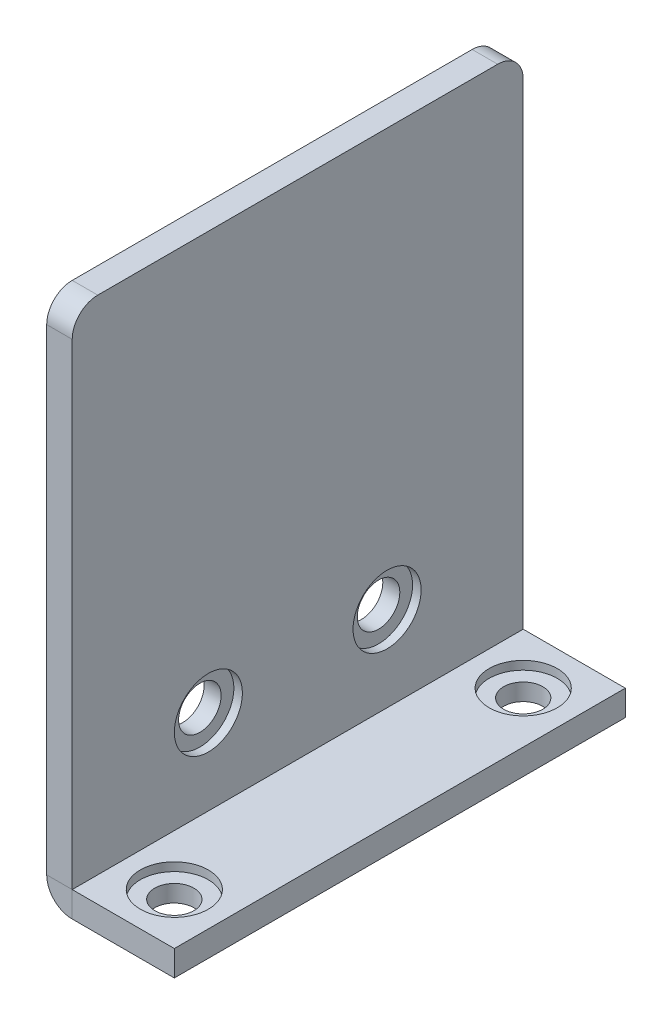
ISO-10303-21;
HEADER;
FILE_DESCRIPTION(('STEP AP214'),'2;1');
FILE_NAME('part.step','',(''),(''),'','','');
FILE_SCHEMA(('AUTOMOTIVE_DESIGN { 1 0 10303 214 1 1 1 1 }'));
ENDSEC;
DATA;
#1=APPLICATION_CONTEXT('core data for automotive mechanical design processes');
#2=APPLICATION_PROTOCOL_DEFINITION('international standard','automotive_design',2000,#1);
#3=PRODUCT_CONTEXT('',#1,'mechanical');
#4=PRODUCT('Part','Part','',(#3));
#5=PRODUCT_RELATED_PRODUCT_CATEGORY('part','',(#4));
#6=PRODUCT_DEFINITION_FORMATION('','',#4);
#7=PRODUCT_DEFINITION_CONTEXT('part definition',#1,'design');
#8=PRODUCT_DEFINITION('design','',#6,#7);
#9=PRODUCT_DEFINITION_SHAPE('','',#8);
#10=(LENGTH_UNIT() NAMED_UNIT(*) SI_UNIT(.MILLI.,.METRE.));
#11=(NAMED_UNIT(*) PLANE_ANGLE_UNIT() SI_UNIT($,.RADIAN.));
#12=(NAMED_UNIT(*) SI_UNIT($,.STERADIAN.) SOLID_ANGLE_UNIT());
#13=UNCERTAINTY_MEASURE_WITH_UNIT(LENGTH_MEASURE(1.E-05),#10,'distance_accuracy_value','');
#14=(GEOMETRIC_REPRESENTATION_CONTEXT(3) GLOBAL_UNCERTAINTY_ASSIGNED_CONTEXT((#13)) GLOBAL_UNIT_ASSIGNED_CONTEXT((#10,
#11,#12)) REPRESENTATION_CONTEXT('',''));
#15=CARTESIAN_POINT('',(0.,0.,0.));
#16=DIRECTION('',(0.,0.,1.));
#17=DIRECTION('',(1.,0.,0.));
#18=AXIS2_PLACEMENT_3D('',#15,#16,#17);
#19=CARTESIAN_POINT('',(0.,0.,53.));
#20=DIRECTION('',(0.,-1.,0.));
#21=DIRECTION('',(0.,0.,-1.));
#22=AXIS2_PLACEMENT_3D('',#19,#20,#21);
#23=PLANE('',#22);
#24=CARTESIAN_POINT('',(9.,0.,6.));
#25=DIRECTION('',(0.,1.,0.));
#26=DIRECTION('',(0.,0.,1.));
#27=AXIS2_PLACEMENT_3D('',#24,#25,#26);
#28=CIRCLE('',#27,2.30000000000001);
#29=CARTESIAN_POINT('',(9.,0.,8.30000000000001));
#30=VERTEX_POINT('',#29);
#31=EDGE_CURVE('E403',#30,#30,#28,.T.);
#32=ORIENTED_EDGE('',*,*,#31,.T.);
#33=EDGE_LOOP('',(#32));
#34=FACE_BOUND('',#33,.T.);
#35=DIRECTION('',(-1.,0.,0.));
#36=VECTOR('',#35,1.);
#37=CARTESIAN_POINT('',(0.,0.,0.));
#38=LINE('',#37,#36);
#39=CARTESIAN_POINT('',(15.,0.,0.));
#40=VERTEX_POINT('',#39);
#41=CARTESIAN_POINT('',(3.,0.,0.));
#42=VERTEX_POINT('',#41);
#43=EDGE_CURVE('E163',#40,#42,#38,.T.);
#44=ORIENTED_EDGE('',*,*,#43,.F.);
#45=DIRECTION('',(0.,0.,-1.));
#46=VECTOR('',#45,1.);
#47=CARTESIAN_POINT('',(15.,0.,53.));
#48=LINE('',#47,#46);
#49=CARTESIAN_POINT('',(15.,0.,53.));
#50=VERTEX_POINT('',#49);
#51=EDGE_CURVE('E176',#50,#40,#48,.T.);
#52=ORIENTED_EDGE('',*,*,#51,.F.);
#53=DIRECTION('',(-1.,0.,0.));
#54=VECTOR('',#53,1.);
#55=CARTESIAN_POINT('',(0.,0.,53.));
#56=LINE('',#55,#54);
#57=CARTESIAN_POINT('',(3.,0.,53.));
#58=VERTEX_POINT('',#57);
#59=EDGE_CURVE('E145',#50,#58,#56,.T.);
#60=ORIENTED_EDGE('',*,*,#59,.T.);
#61=DIRECTION('',(0.,0.,-1.));
#62=VECTOR('',#61,1.);
#63=CARTESIAN_POINT('',(3.,0.,53.));
#64=LINE('',#63,#62);
#65=EDGE_CURVE('E137',#58,#42,#64,.T.);
#66=ORIENTED_EDGE('',*,*,#65,.T.);
#67=EDGE_LOOP('',(#44,#52,#60,#66));
#68=FACE_BOUND('',#67,.T.);
#69=CARTESIAN_POINT('',(9.00000000000001,0.,47.));
#70=DIRECTION('',(0.,1.,0.));
#71=DIRECTION('',(0.,0.,1.));
#72=AXIS2_PLACEMENT_3D('',#69,#70,#71);
#73=CIRCLE('',#72,2.30000000000001);
#74=CARTESIAN_POINT('',(9.00000000000001,0.,49.3));
#75=VERTEX_POINT('',#74);
#76=EDGE_CURVE('E414',#75,#75,#73,.T.);
#77=ORIENTED_EDGE('',*,*,#76,.T.);
#78=EDGE_LOOP('',(#77));
#79=FACE_BOUND('',#78,.T.);
#80=ADVANCED_FACE('F41',(#34,#68,#79),#23,.T.);
#81=CARTESIAN_POINT('',(0.,3.,53.));
#82=DIRECTION('',(0.,-1.,0.));
#83=DIRECTION('',(0.,0.,-1.));
#84=AXIS2_PLACEMENT_3D('',#81,#82,#83);
#85=PLANE('',#84);
#86=CARTESIAN_POINT('',(9.,3.,6.));
#87=DIRECTION('',(0.,1.,0.));
#88=DIRECTION('',(0.,0.,1.));
#89=AXIS2_PLACEMENT_3D('',#86,#87,#88);
#90=CIRCLE('',#89,3.99999999999999);
#91=CARTESIAN_POINT('',(9.,3.,9.99999999999999));
#92=VERTEX_POINT('',#91);
#93=EDGE_CURVE('E394',#92,#92,#90,.T.);
#94=ORIENTED_EDGE('',*,*,#93,.F.);
#95=EDGE_LOOP('',(#94));
#96=FACE_BOUND('',#95,.T.);
#97=DIRECTION('',(1.,0.,0.));
#98=VECTOR('',#97,1.);
#99=CARTESIAN_POINT('',(0.,3.,0.));
#100=LINE('',#99,#98);
#101=CARTESIAN_POINT('',(15.,3.,0.));
#102=VERTEX_POINT('',#101);
#103=CARTESIAN_POINT('',(3.,3.,0.));
#104=VERTEX_POINT('',#103);
#105=EDGE_CURVE('E169',#102,#104,#100,.F.);
#106=ORIENTED_EDGE('',*,*,#105,.T.);
#107=DIRECTION('',(0.,0.,-1.));
#108=VECTOR('',#107,1.);
#109=CARTESIAN_POINT('',(3.,3.,53.));
#110=LINE('',#109,#108);
#111=CARTESIAN_POINT('',(3.,3.,53.));
#112=VERTEX_POINT('',#111);
#113=EDGE_CURVE('E155',#112,#104,#110,.T.);
#114=ORIENTED_EDGE('',*,*,#113,.F.);
#115=DIRECTION('',(1.,0.,0.));
#116=VECTOR('',#115,1.);
#117=CARTESIAN_POINT('',(0.,3.,53.));
#118=LINE('',#117,#116);
#119=CARTESIAN_POINT('',(15.,3.,53.));
#120=VERTEX_POINT('',#119);
#121=EDGE_CURVE('E153',#120,#112,#118,.F.);
#122=ORIENTED_EDGE('',*,*,#121,.F.);
#123=DIRECTION('',(0.,0.,-1.));
#124=VECTOR('',#123,1.);
#125=CARTESIAN_POINT('',(15.,3.,53.));
#126=LINE('',#125,#124);
#127=EDGE_CURVE('E174',#120,#102,#126,.T.);
#128=ORIENTED_EDGE('',*,*,#127,.T.);
#129=EDGE_LOOP('',(#106,#114,#122,#128));
#130=FACE_BOUND('',#129,.T.);
#131=CARTESIAN_POINT('',(9.00000000000001,3.,47.));
#132=DIRECTION('',(0.,1.,0.));
#133=DIRECTION('',(0.,0.,1.));
#134=AXIS2_PLACEMENT_3D('',#131,#132,#133);
#135=CIRCLE('',#134,3.99999999999999);
#136=CARTESIAN_POINT('',(9.00000000000001,3.,51.));
#137=VERTEX_POINT('',#136);
#138=EDGE_CURVE('E405',#137,#137,#135,.T.);
#139=ORIENTED_EDGE('',*,*,#138,.F.);
#140=EDGE_LOOP('',(#139));
#141=FACE_BOUND('',#140,.T.);
#142=ADVANCED_FACE('F224',(#96,#130,#141),#85,.F.);
#143=CARTESIAN_POINT('',(3.,3.,53.));
#144=DIRECTION('',(0.,0.,1.));
#145=DIRECTION('',(1.,0.,0.));
#146=AXIS2_PLACEMENT_3D('',#143,#144,#145);
#147=PLANE('',#146);
#148=DIRECTION('',(0.,1.,0.));
#149=VECTOR('',#148,1.);
#150=CARTESIAN_POINT('',(3.,0.,53.));
#151=LINE('',#150,#149);
#152=CARTESIAN_POINT('',(3.,59.,53.));
#153=VERTEX_POINT('',#152);
#154=EDGE_CURVE('E140',#112,#153,#151,.T.);
#155=ORIENTED_EDGE('',*,*,#154,.T.);
#156=DIRECTION('',(1.,0.,0.));
#157=VECTOR('',#156,1.);
#158=CARTESIAN_POINT('',(3.,59.,53.));
#159=LINE('',#158,#157);
#160=CARTESIAN_POINT('',(0.,59.,53.));
#161=VERTEX_POINT('',#160);
#162=EDGE_CURVE('E65',#153,#161,#159,.F.);
#163=ORIENTED_EDGE('',*,*,#162,.T.);
#164=DIRECTION('',(0.,1.,0.));
#165=VECTOR('',#164,1.);
#166=CARTESIAN_POINT('',(0.,0.,53.));
#167=LINE('',#166,#165);
#168=CARTESIAN_POINT('',(0.,3.,53.));
#169=VERTEX_POINT('',#168);
#170=EDGE_CURVE('E130',#169,#161,#167,.T.);
#171=ORIENTED_EDGE('',*,*,#170,.F.);
#172=DIRECTION('',(-1.,0.,0.));
#173=VECTOR('',#172,1.);
#174=CARTESIAN_POINT('',(3.,3.,53.));
#175=LINE('',#174,#173);
#176=EDGE_CURVE('E117',#112,#169,#175,.T.);
#177=ORIENTED_EDGE('',*,*,#176,.F.);
#178=EDGE_LOOP('',(#155,#163,#171,#177));
#179=FACE_BOUND('',#178,.T.);
#180=ADVANCED_FACE('F139',(#179),#147,.T.);
#181=CARTESIAN_POINT('',(3.,3.,53.));
#182=DIRECTION('',(0.,0.,1.));
#183=DIRECTION('',(1.,0.,0.));
#184=AXIS2_PLACEMENT_3D('',#181,#182,#183);
#185=PLANE('',#184);
#186=DIRECTION('',(0.,-1.,0.));
#187=VECTOR('',#186,1.);
#188=CARTESIAN_POINT('',(3.,3.,53.));
#189=LINE('',#188,#187);
#190=EDGE_CURVE('E123',#112,#58,#189,.T.);
#191=ORIENTED_EDGE('',*,*,#190,.F.);
#192=ORIENTED_EDGE('',*,*,#176,.T.);
#193=CARTESIAN_POINT('',(3.,3.,53.));
#194=DIRECTION('',(0.,0.,1.));
#195=DIRECTION('',(1.,0.,0.));
#196=AXIS2_PLACEMENT_3D('',#193,#194,#195);
#197=CIRCLE('',#196,3.);
#198=EDGE_CURVE('E121',#58,#169,#197,.F.);
#199=ORIENTED_EDGE('',*,*,#198,.F.);
#200=EDGE_LOOP('',(#191,#192,#199));
#201=FACE_BOUND('',#200,.T.);
#202=ADVANCED_FACE('F119',(#201),#185,.T.);
#203=CARTESIAN_POINT('',(3.,3.,0.));
#204=DIRECTION('',(0.,0.,-1.));
#205=DIRECTION('',(-1.,0.,0.));
#206=AXIS2_PLACEMENT_3D('',#203,#204,#205);
#207=PLANE('',#206);
#208=DIRECTION('',(0.,-1.,0.));
#209=VECTOR('',#208,1.);
#210=CARTESIAN_POINT('',(3.,3.,0.));
#211=LINE('',#210,#209);
#212=EDGE_CURVE('E185',#104,#42,#211,.T.);
#213=ORIENTED_EDGE('',*,*,#212,.F.);
#214=ORIENTED_EDGE('',*,*,#105,.F.);
#215=DIRECTION('',(0.,-1.,0.));
#216=VECTOR('',#215,1.);
#217=CARTESIAN_POINT('',(15.,3.,0.));
#218=LINE('',#217,#216);
#219=EDGE_CURVE('E166',#102,#40,#218,.T.);
#220=ORIENTED_EDGE('',*,*,#219,.T.);
#221=ORIENTED_EDGE('',*,*,#43,.T.);
#222=EDGE_LOOP('',(#213,#214,#220,#221));
#223=FACE_BOUND('',#222,.T.);
#224=ADVANCED_FACE('F254',(#223),#207,.T.);
#225=CARTESIAN_POINT('',(3.,3.,0.));
#226=DIRECTION('',(0.,0.,-1.));
#227=DIRECTION('',(-1.,0.,0.));
#228=AXIS2_PLACEMENT_3D('',#225,#226,#227);
#229=PLANE('',#228);
#230=DIRECTION('',(-1.,0.,0.));
#231=VECTOR('',#230,1.);
#232=CARTESIAN_POINT('',(3.,3.,0.));
#233=LINE('',#232,#231);
#234=CARTESIAN_POINT('',(0.,3.,0.));
#235=VERTEX_POINT('',#234);
#236=EDGE_CURVE('E183',#104,#235,#233,.T.);
#237=ORIENTED_EDGE('',*,*,#236,.F.);
#238=ORIENTED_EDGE('',*,*,#212,.T.);
#239=CARTESIAN_POINT('',(3.,3.,0.));
#240=DIRECTION('',(0.,0.,1.));
#241=DIRECTION('',(1.,0.,0.));
#242=AXIS2_PLACEMENT_3D('',#239,#240,#241);
#243=CIRCLE('',#242,3.);
#244=EDGE_CURVE('E161',#42,#235,#243,.F.);
#245=ORIENTED_EDGE('',*,*,#244,.T.);
#246=EDGE_LOOP('',(#237,#238,#245));
#247=FACE_BOUND('',#246,.T.);
#248=ADVANCED_FACE('F250',(#247),#229,.T.);
#249=CARTESIAN_POINT('',(3.,0.,53.));
#250=DIRECTION('',(-1.,0.,0.));
#251=DIRECTION('',(0.,0.,1.));
#252=AXIS2_PLACEMENT_3D('',#249,#250,#251);
#253=PLANE('',#252);
#254=CARTESIAN_POINT('',(3.,13.,37.));
#255=DIRECTION('',(1.,0.,0.));
#256=DIRECTION('',(0.,0.,-1.));
#257=AXIS2_PLACEMENT_3D('',#254,#255,#256);
#258=CIRCLE('',#257,3.99999999999999);
#259=CARTESIAN_POINT('',(3.,13.,33.));
#260=VERTEX_POINT('',#259);
#261=EDGE_CURVE('E373',#260,#260,#258,.T.);
#262=ORIENTED_EDGE('',*,*,#261,.F.);
#263=EDGE_LOOP('',(#262));
#264=FACE_BOUND('',#263,.T.);
#265=CARTESIAN_POINT('',(3.,13.,16.));
#266=DIRECTION('',(1.,0.,0.));
#267=DIRECTION('',(0.,0.,-1.));
#268=AXIS2_PLACEMENT_3D('',#265,#266,#267);
#269=CIRCLE('',#268,3.99999999999999);
#270=CARTESIAN_POINT('',(3.,13.,12.));
#271=VERTEX_POINT('',#270);
#272=EDGE_CURVE('E382',#271,#271,#269,.T.);
#273=ORIENTED_EDGE('',*,*,#272,.F.);
#274=EDGE_LOOP('',(#273));
#275=FACE_BOUND('',#274,.T.);
#276=DIRECTION('',(0.,0.,-1.));
#277=VECTOR('',#276,1.);
#278=CARTESIAN_POINT('',(3.,62.,53.));
#279=LINE('',#278,#277);
#280=CARTESIAN_POINT('',(3.,62.,50.));
#281=VERTEX_POINT('',#280);
#282=CARTESIAN_POINT('',(3.,62.,3.));
#283=VERTEX_POINT('',#282);
#284=EDGE_CURVE('E180',#281,#283,#279,.T.);
#285=ORIENTED_EDGE('',*,*,#284,.F.);
#286=CARTESIAN_POINT('',(3.,59.,50.));
#287=DIRECTION('',(-1.,0.,0.));
#288=DIRECTION('',(0.,0.,1.));
#289=AXIS2_PLACEMENT_3D('',#286,#287,#288);
#290=CIRCLE('',#289,3.);
#291=EDGE_CURVE('E200',#281,#153,#290,.F.);
#292=ORIENTED_EDGE('',*,*,#291,.T.);
#293=ORIENTED_EDGE('',*,*,#154,.F.);
#294=ORIENTED_EDGE('',*,*,#113,.T.);
#295=DIRECTION('',(0.,1.,0.));
#296=VECTOR('',#295,1.);
#297=CARTESIAN_POINT('',(3.,0.,0.));
#298=LINE('',#297,#296);
#299=CARTESIAN_POINT('',(3.,59.,0.));
#300=VERTEX_POINT('',#299);
#301=EDGE_CURVE('E156',#104,#300,#298,.T.);
#302=ORIENTED_EDGE('',*,*,#301,.T.);
#303=CARTESIAN_POINT('',(3.,59.,3.));
#304=DIRECTION('',(-1.,0.,0.));
#305=DIRECTION('',(0.,0.,1.));
#306=AXIS2_PLACEMENT_3D('',#303,#304,#305);
#307=CIRCLE('',#306,3.);
#308=EDGE_CURVE('E198',#300,#283,#307,.F.);
#309=ORIENTED_EDGE('',*,*,#308,.T.);
#310=EDGE_LOOP('',(#285,#292,#293,#294,#302,#309));
#311=FACE_BOUND('',#310,.T.);
#312=ADVANCED_FACE('F246',(#264,#275,#311),#253,.F.);
#313=CARTESIAN_POINT('',(0.,62.,53.));
#314=DIRECTION('',(0.,1.,0.));
#315=DIRECTION('',(0.,0.,1.));
#316=AXIS2_PLACEMENT_3D('',#313,#314,#315);
#317=PLANE('',#316);
#318=DIRECTION('',(0.,0.,-1.));
#319=VECTOR('',#318,1.);
#320=CARTESIAN_POINT('',(0.,62.,53.));
#321=LINE('',#320,#319);
#322=CARTESIAN_POINT('',(0.,62.,50.));
#323=VERTEX_POINT('',#322);
#324=CARTESIAN_POINT('',(0.,62.,3.));
#325=VERTEX_POINT('',#324);
#326=EDGE_CURVE('E136',#323,#325,#321,.T.);
#327=ORIENTED_EDGE('',*,*,#326,.F.);
#328=DIRECTION('',(1.,0.,0.));
#329=VECTOR('',#328,1.);
#330=CARTESIAN_POINT('',(0.,62.,50.));
#331=LINE('',#330,#329);
#332=EDGE_CURVE('E195',#323,#281,#331,.T.);
#333=ORIENTED_EDGE('',*,*,#332,.T.);
#334=ORIENTED_EDGE('',*,*,#284,.T.);
#335=DIRECTION('',(1.,0.,0.));
#336=VECTOR('',#335,1.);
#337=CARTESIAN_POINT('',(0.,62.,3.));
#338=LINE('',#337,#336);
#339=EDGE_CURVE('E193',#283,#325,#338,.F.);
#340=ORIENTED_EDGE('',*,*,#339,.T.);
#341=EDGE_LOOP('',(#327,#333,#334,#340));
#342=FACE_BOUND('',#341,.T.);
#343=ADVANCED_FACE('F241',(#342),#317,.T.);
#344=CARTESIAN_POINT('',(0.,0.,53.));
#345=DIRECTION('',(-1.,0.,0.));
#346=DIRECTION('',(0.,0.,1.));
#347=AXIS2_PLACEMENT_3D('',#344,#345,#346);
#348=PLANE('',#347);
#349=CARTESIAN_POINT('',(0.,13.,37.));
#350=DIRECTION('',(1.,0.,0.));
#351=DIRECTION('',(0.,0.,-1.));
#352=AXIS2_PLACEMENT_3D('',#349,#350,#351);
#353=CIRCLE('',#352,2.5);
#354=CARTESIAN_POINT('',(0.,13.,34.5));
#355=VERTEX_POINT('',#354);
#356=EDGE_CURVE('E375',#355,#355,#353,.T.);
#357=ORIENTED_EDGE('',*,*,#356,.T.);
#358=EDGE_LOOP('',(#357));
#359=FACE_BOUND('',#358,.T.);
#360=CARTESIAN_POINT('',(0.,13.,16.));
#361=DIRECTION('',(1.,0.,0.));
#362=DIRECTION('',(0.,0.,-1.));
#363=AXIS2_PLACEMENT_3D('',#360,#361,#362);
#364=CIRCLE('',#363,2.5);
#365=CARTESIAN_POINT('',(0.,13.,13.5));
#366=VERTEX_POINT('',#365);
#367=EDGE_CURVE('E391',#366,#366,#364,.T.);
#368=ORIENTED_EDGE('',*,*,#367,.T.);
#369=EDGE_LOOP('',(#368));
#370=FACE_BOUND('',#369,.T.);
#371=CARTESIAN_POINT('',(0.,35.,26.5));
#372=DIRECTION('',(-1.,0.,0.));
#373=DIRECTION('',(0.,0.,1.));
#374=AXIS2_PLACEMENT_3D('',#371,#372,#373);
#375=CIRCLE('',#374,9.);
#376=CARTESIAN_POINT('',(0.,35.,35.5));
#377=VERTEX_POINT('',#376);
#378=EDGE_CURVE('E420',#377,#377,#375,.T.);
#379=ORIENTED_EDGE('',*,*,#378,.F.);
#380=EDGE_LOOP('',(#379));
#381=FACE_BOUND('',#380,.T.);
#382=ORIENTED_EDGE('',*,*,#170,.T.);
#383=CARTESIAN_POINT('',(0.,59.,50.));
#384=DIRECTION('',(-1.,0.,0.));
#385=DIRECTION('',(0.,0.,1.));
#386=AXIS2_PLACEMENT_3D('',#383,#384,#385);
#387=CIRCLE('',#386,3.);
#388=EDGE_CURVE('E204',#161,#323,#387,.T.);
#389=ORIENTED_EDGE('',*,*,#388,.T.);
#390=ORIENTED_EDGE('',*,*,#326,.T.);
#391=CARTESIAN_POINT('',(0.,59.,3.));
#392=DIRECTION('',(-1.,0.,0.));
#393=DIRECTION('',(0.,0.,1.));
#394=AXIS2_PLACEMENT_3D('',#391,#392,#393);
#395=CIRCLE('',#394,3.);
#396=CARTESIAN_POINT('',(0.,59.,0.));
#397=VERTEX_POINT('',#396);
#398=EDGE_CURVE('E57',#325,#397,#395,.T.);
#399=ORIENTED_EDGE('',*,*,#398,.T.);
#400=DIRECTION('',(0.,1.,0.));
#401=VECTOR('',#400,1.);
#402=CARTESIAN_POINT('',(0.,0.,0.));
#403=LINE('',#402,#401);
#404=EDGE_CURVE('E132',#235,#397,#403,.T.);
#405=ORIENTED_EDGE('',*,*,#404,.F.);
#406=DIRECTION('',(0.,0.,-1.));
#407=VECTOR('',#406,1.);
#408=CARTESIAN_POINT('',(0.,3.,53.));
#409=LINE('',#408,#407);
#410=EDGE_CURVE('E128',#169,#235,#409,.T.);
#411=ORIENTED_EDGE('',*,*,#410,.F.);
#412=EDGE_LOOP('',(#382,#389,#390,#399,#405,#411));
#413=FACE_BOUND('',#412,.T.);
#414=ADVANCED_FACE('F129',(#359,#370,#381,#413),#348,.T.);
#415=CARTESIAN_POINT('',(3.,3.,53.));
#416=DIRECTION('',(0.,0.,-1.));
#417=DIRECTION('',(-1.,0.,0.));
#418=AXIS2_PLACEMENT_3D('',#415,#416,#417);
#419=CYLINDRICAL_SURFACE('',#418,3.);
#420=ORIENTED_EDGE('',*,*,#244,.F.);
#421=ORIENTED_EDGE('',*,*,#65,.F.);
#422=ORIENTED_EDGE('',*,*,#198,.T.);
#423=ORIENTED_EDGE('',*,*,#410,.T.);
#424=EDGE_LOOP('',(#420,#421,#422,#423));
#425=FACE_BOUND('',#424,.T.);
#426=ADVANCED_FACE('F143',(#425),#419,.T.);
#427=CARTESIAN_POINT('',(15.,3.,53.));
#428=DIRECTION('',(1.,0.,0.));
#429=DIRECTION('',(0.,0.,-1.));
#430=AXIS2_PLACEMENT_3D('',#427,#428,#429);
#431=PLANE('',#430);
#432=ORIENTED_EDGE('',*,*,#219,.F.);
#433=ORIENTED_EDGE('',*,*,#127,.F.);
#434=DIRECTION('',(0.,-1.,0.));
#435=VECTOR('',#434,1.);
#436=CARTESIAN_POINT('',(15.,3.,53.));
#437=LINE('',#436,#435);
#438=EDGE_CURVE('E147',#120,#50,#437,.T.);
#439=ORIENTED_EDGE('',*,*,#438,.T.);
#440=ORIENTED_EDGE('',*,*,#51,.T.);
#441=EDGE_LOOP('',(#432,#433,#439,#440));
#442=FACE_BOUND('',#441,.T.);
#443=ADVANCED_FACE('F236',(#442),#431,.T.);
#444=CARTESIAN_POINT('',(3.,3.,53.));
#445=DIRECTION('',(0.,0.,1.));
#446=DIRECTION('',(1.,0.,0.));
#447=AXIS2_PLACEMENT_3D('',#444,#445,#446);
#448=PLANE('',#447);
#449=ORIENTED_EDGE('',*,*,#121,.T.);
#450=ORIENTED_EDGE('',*,*,#190,.T.);
#451=ORIENTED_EDGE('',*,*,#59,.F.);
#452=ORIENTED_EDGE('',*,*,#438,.F.);
#453=EDGE_LOOP('',(#449,#450,#451,#452));
#454=FACE_BOUND('',#453,.T.);
#455=ADVANCED_FACE('F295',(#454),#448,.T.);
#456=CARTESIAN_POINT('',(3.,3.,0.));
#457=DIRECTION('',(0.,0.,1.));
#458=DIRECTION('',(1.,0.,0.));
#459=AXIS2_PLACEMENT_3D('',#456,#457,#458);
#460=PLANE('',#459);
#461=ORIENTED_EDGE('',*,*,#404,.T.);
#462=DIRECTION('',(1.,0.,0.));
#463=VECTOR('',#462,1.);
#464=CARTESIAN_POINT('',(3.,59.,0.));
#465=LINE('',#464,#463);
#466=EDGE_CURVE('E206',#397,#300,#465,.T.);
#467=ORIENTED_EDGE('',*,*,#466,.T.);
#468=ORIENTED_EDGE('',*,*,#301,.F.);
#469=ORIENTED_EDGE('',*,*,#236,.T.);
#470=EDGE_LOOP('',(#461,#467,#468,#469));
#471=FACE_BOUND('',#470,.T.);
#472=ADVANCED_FACE('F279',(#471),#460,.F.);
#473=CARTESIAN_POINT('',(-4.,35.,26.5));
#474=DIRECTION('',(-1.,0.,0.));
#475=DIRECTION('',(0.,0.,1.));
#476=AXIS2_PLACEMENT_3D('',#473,#474,#475);
#477=PLANE('',#476);
#478=CARTESIAN_POINT('',(-4.,35.,26.5));
#479=DIRECTION('',(-1.,0.,0.));
#480=DIRECTION('',(0.,0.,1.));
#481=AXIS2_PLACEMENT_3D('',#478,#479,#480);
#482=CIRCLE('',#481,7.00000000000001);
#483=CARTESIAN_POINT('',(-4.,35.,33.5));
#484=VERTEX_POINT('',#483);
#485=EDGE_CURVE('E11',#484,#484,#482,.F.);
#486=ORIENTED_EDGE('',*,*,#485,.T.);
#487=EDGE_LOOP('',(#486));
#488=FACE_BOUND('',#487,.T.);
#489=CARTESIAN_POINT('',(-4.,35.,26.5));
#490=DIRECTION('',(-1.,0.,0.));
#491=DIRECTION('',(0.,0.,1.));
#492=AXIS2_PLACEMENT_3D('',#489,#490,#491);
#493=CIRCLE('',#492,9.);
#494=CARTESIAN_POINT('',(-4.,35.,35.5));
#495=VERTEX_POINT('',#494);
#496=EDGE_CURVE('E159',#495,#495,#493,.T.);
#497=ORIENTED_EDGE('',*,*,#496,.T.);
#498=EDGE_LOOP('',(#497));
#499=FACE_BOUND('',#498,.T.);
#500=ADVANCED_FACE('F302',(#488,#499),#477,.T.);
#501=CARTESIAN_POINT('',(-4.,35.,26.5));
#502=DIRECTION('',(1.,0.,0.));
#503=DIRECTION('',(0.,0.,-1.));
#504=AXIS2_PLACEMENT_3D('',#501,#502,#503);
#505=CYLINDRICAL_SURFACE('',#504,9.);
#506=ORIENTED_EDGE('',*,*,#496,.F.);
#507=EDGE_LOOP('',(#506));
#508=FACE_BOUND('',#507,.T.);
#509=ORIENTED_EDGE('',*,*,#378,.T.);
#510=EDGE_LOOP('',(#509));
#511=FACE_BOUND('',#510,.T.);
#512=ADVANCED_FACE('F305',(#508,#511),#505,.T.);
#513=CARTESIAN_POINT('',(-4.,35.,26.5));
#514=DIRECTION('',(1.,0.,0.));
#515=DIRECTION('',(0.,0.,-1.));
#516=AXIS2_PLACEMENT_3D('',#513,#514,#515);
#517=CYLINDRICAL_SURFACE('',#516,6.);
#518=CARTESIAN_POINT('',(-3.,35.,26.5));
#519=DIRECTION('',(-1.,0.,0.));
#520=DIRECTION('',(0.,0.,1.));
#521=AXIS2_PLACEMENT_3D('',#518,#519,#520);
#522=CIRCLE('',#521,6.);
#523=CARTESIAN_POINT('',(-3.,35.,32.5));
#524=VERTEX_POINT('',#523);
#525=EDGE_CURVE('E50',#524,#524,#522,.T.);
#526=ORIENTED_EDGE('',*,*,#525,.T.);
#527=EDGE_LOOP('',(#526));
#528=FACE_BOUND('',#527,.T.);
#529=CARTESIAN_POINT('',(-1.,35.,26.5));
#530=DIRECTION('',(-1.,0.,0.));
#531=DIRECTION('',(0.,0.,1.));
#532=AXIS2_PLACEMENT_3D('',#529,#530,#531);
#533=CIRCLE('',#532,6.);
#534=CARTESIAN_POINT('',(-1.,35.,32.5));
#535=VERTEX_POINT('',#534);
#536=EDGE_CURVE('E190',#535,#535,#533,.T.);
#537=ORIENTED_EDGE('',*,*,#536,.F.);
#538=EDGE_LOOP('',(#537));
#539=FACE_BOUND('',#538,.T.);
#540=ADVANCED_FACE('F211',(#528,#539),#517,.F.);
#541=CARTESIAN_POINT('',(-1.,35.,26.5));
#542=DIRECTION('',(-1.,0.,0.));
#543=DIRECTION('',(0.,0.,1.));
#544=AXIS2_PLACEMENT_3D('',#541,#542,#543);
#545=PLANE('',#544);
#546=ORIENTED_EDGE('',*,*,#536,.T.);
#547=EDGE_LOOP('',(#546));
#548=FACE_BOUND('',#547,.T.);
#549=CARTESIAN_POINT('',(-1.,35.,26.5));
#550=DIRECTION('',(-1.,0.,0.));
#551=DIRECTION('',(0.,0.,1.));
#552=AXIS2_PLACEMENT_3D('',#549,#550,#551);
#553=CIRCLE('',#552,5.);
#554=CARTESIAN_POINT('',(-1.,35.,31.5));
#555=VERTEX_POINT('',#554);
#556=EDGE_CURVE('E417',#555,#555,#553,.T.);
#557=ORIENTED_EDGE('',*,*,#556,.F.);
#558=EDGE_LOOP('',(#557));
#559=FACE_BOUND('',#558,.T.);
#560=ADVANCED_FACE('F314',(#548,#559),#545,.T.);
#561=CARTESIAN_POINT('',(-1.,35.,26.5));
#562=DIRECTION('',(1.,0.,0.));
#563=DIRECTION('',(0.,0.,-1.));
#564=AXIS2_PLACEMENT_3D('',#561,#562,#563);
#565=CYLINDRICAL_SURFACE('',#564,5.);
#566=ORIENTED_EDGE('',*,*,#556,.T.);
#567=EDGE_LOOP('',(#566));
#568=FACE_BOUND('',#567,.T.);
#569=CARTESIAN_POINT('',(0.,35.,26.5));
#570=DIRECTION('',(-1.,0.,0.));
#571=DIRECTION('',(0.,0.,1.));
#572=AXIS2_PLACEMENT_3D('',#569,#570,#571);
#573=CIRCLE('',#572,5.);
#574=CARTESIAN_POINT('',(0.,35.,31.5));
#575=VERTEX_POINT('',#574);
#576=EDGE_CURVE('E125',#575,#575,#573,.F.);
#577=ORIENTED_EDGE('',*,*,#576,.T.);
#578=EDGE_LOOP('',(#577));
#579=FACE_BOUND('',#578,.T.);
#580=ADVANCED_FACE('F317',(#568,#579),#565,.F.);
#581=ORIENTED_EDGE('',*,*,#576,.F.);
#582=EDGE_LOOP('',(#581));
#583=FACE_BOUND('',#582,.T.);
#584=ADVANCED_FACE('F243',(#583),#348,.T.);
#585=CARTESIAN_POINT('',(9.00000000000001,3.,47.));
#586=DIRECTION('',(0.,1.,0.));
#587=DIRECTION('',(0.,0.,1.));
#588=AXIS2_PLACEMENT_3D('',#585,#586,#587);
#589=CYLINDRICAL_SURFACE('',#588,2.30000000000001);
#590=ORIENTED_EDGE('',*,*,#76,.F.);
#591=EDGE_LOOP('',(#590));
#592=FACE_BOUND('',#591,.T.);
#593=CARTESIAN_POINT('',(9.00000000000001,2.,47.));
#594=DIRECTION('',(0.,1.,0.));
#595=DIRECTION('',(0.,0.,1.));
#596=AXIS2_PLACEMENT_3D('',#593,#594,#595);
#597=CIRCLE('',#596,2.3);
#598=CARTESIAN_POINT('',(9.00000000000001,2.,49.3));
#599=VERTEX_POINT('',#598);
#600=EDGE_CURVE('E411',#599,#599,#597,.T.);
#601=ORIENTED_EDGE('',*,*,#600,.T.);
#602=EDGE_LOOP('',(#601));
#603=FACE_BOUND('',#602,.T.);
#604=ADVANCED_FACE('F322',(#592,#603),#589,.F.);
#605=CARTESIAN_POINT('',(11.3,2.,47.));
#606=DIRECTION('',(0.,-1.,0.));
#607=DIRECTION('',(0.,0.,-1.));
#608=AXIS2_PLACEMENT_3D('',#605,#606,#607);
#609=PLANE('',#608);
#610=ORIENTED_EDGE('',*,*,#600,.F.);
#611=EDGE_LOOP('',(#610));
#612=FACE_BOUND('',#611,.T.);
#613=CARTESIAN_POINT('',(9.00000000000001,2.,47.));
#614=DIRECTION('',(0.,1.,0.));
#615=DIRECTION('',(0.,0.,1.));
#616=AXIS2_PLACEMENT_3D('',#613,#614,#615);
#617=CIRCLE('',#616,4.);
#618=CARTESIAN_POINT('',(9.00000000000001,2.,51.));
#619=VERTEX_POINT('',#618);
#620=EDGE_CURVE('E408',#619,#619,#617,.T.);
#621=ORIENTED_EDGE('',*,*,#620,.T.);
#622=EDGE_LOOP('',(#621));
#623=FACE_BOUND('',#622,.T.);
#624=ADVANCED_FACE('F325',(#612,#623),#609,.F.);
#625=CARTESIAN_POINT('',(9.00000000000001,3.,47.));
#626=DIRECTION('',(0.,1.,0.));
#627=DIRECTION('',(0.,0.,1.));
#628=AXIS2_PLACEMENT_3D('',#625,#626,#627);
#629=CYLINDRICAL_SURFACE('',#628,3.99999999999999);
#630=ORIENTED_EDGE('',*,*,#620,.F.);
#631=EDGE_LOOP('',(#630));
#632=FACE_BOUND('',#631,.T.);
#633=ORIENTED_EDGE('',*,*,#138,.T.);
#634=EDGE_LOOP('',(#633));
#635=FACE_BOUND('',#634,.T.);
#636=ADVANCED_FACE('F329',(#632,#635),#629,.F.);
#637=CARTESIAN_POINT('',(9.,3.,6.));
#638=DIRECTION('',(0.,1.,0.));
#639=DIRECTION('',(0.,0.,1.));
#640=AXIS2_PLACEMENT_3D('',#637,#638,#639);
#641=CYLINDRICAL_SURFACE('',#640,2.30000000000001);
#642=ORIENTED_EDGE('',*,*,#31,.F.);
#643=EDGE_LOOP('',(#642));
#644=FACE_BOUND('',#643,.T.);
#645=CARTESIAN_POINT('',(9.,2.,6.));
#646=DIRECTION('',(0.,1.,0.));
#647=DIRECTION('',(0.,0.,1.));
#648=AXIS2_PLACEMENT_3D('',#645,#646,#647);
#649=CIRCLE('',#648,2.3);
#650=CARTESIAN_POINT('',(9.,2.,8.3));
#651=VERTEX_POINT('',#650);
#652=EDGE_CURVE('E400',#651,#651,#649,.T.);
#653=ORIENTED_EDGE('',*,*,#652,.T.);
#654=EDGE_LOOP('',(#653));
#655=FACE_BOUND('',#654,.T.);
#656=ADVANCED_FACE('F333',(#644,#655),#641,.F.);
#657=CARTESIAN_POINT('',(11.3,2.,6.));
#658=DIRECTION('',(0.,-1.,0.));
#659=DIRECTION('',(0.,0.,-1.));
#660=AXIS2_PLACEMENT_3D('',#657,#658,#659);
#661=PLANE('',#660);
#662=ORIENTED_EDGE('',*,*,#652,.F.);
#663=EDGE_LOOP('',(#662));
#664=FACE_BOUND('',#663,.T.);
#665=CARTESIAN_POINT('',(9.,2.,6.));
#666=DIRECTION('',(0.,1.,0.));
#667=DIRECTION('',(0.,0.,1.));
#668=AXIS2_PLACEMENT_3D('',#665,#666,#667);
#669=CIRCLE('',#668,4.);
#670=CARTESIAN_POINT('',(9.,2.,10.));
#671=VERTEX_POINT('',#670);
#672=EDGE_CURVE('E397',#671,#671,#669,.T.);
#673=ORIENTED_EDGE('',*,*,#672,.T.);
#674=EDGE_LOOP('',(#673));
#675=FACE_BOUND('',#674,.T.);
#676=ADVANCED_FACE('F337',(#664,#675),#661,.F.);
#677=CARTESIAN_POINT('',(9.,3.,6.));
#678=DIRECTION('',(0.,1.,0.));
#679=DIRECTION('',(0.,0.,1.));
#680=AXIS2_PLACEMENT_3D('',#677,#678,#679);
#681=CYLINDRICAL_SURFACE('',#680,3.99999999999999);
#682=ORIENTED_EDGE('',*,*,#672,.F.);
#683=EDGE_LOOP('',(#682));
#684=FACE_BOUND('',#683,.T.);
#685=ORIENTED_EDGE('',*,*,#93,.T.);
#686=EDGE_LOOP('',(#685));
#687=FACE_BOUND('',#686,.T.);
#688=ADVANCED_FACE('F341',(#684,#687),#681,.F.);
#689=CARTESIAN_POINT('',(3.,13.,16.));
#690=DIRECTION('',(1.,0.,0.));
#691=DIRECTION('',(0.,0.,-1.));
#692=AXIS2_PLACEMENT_3D('',#689,#690,#691);
#693=CYLINDRICAL_SURFACE('',#692,2.5);
#694=ORIENTED_EDGE('',*,*,#367,.F.);
#695=EDGE_LOOP('',(#694));
#696=FACE_BOUND('',#695,.T.);
#697=CARTESIAN_POINT('',(2.,13.,16.));
#698=DIRECTION('',(1.,0.,0.));
#699=DIRECTION('',(0.,0.,-1.));
#700=AXIS2_PLACEMENT_3D('',#697,#698,#699);
#701=CIRCLE('',#700,2.5);
#702=CARTESIAN_POINT('',(2.,13.,13.5));
#703=VERTEX_POINT('',#702);
#704=EDGE_CURVE('E388',#703,#703,#701,.T.);
#705=ORIENTED_EDGE('',*,*,#704,.T.);
#706=EDGE_LOOP('',(#705));
#707=FACE_BOUND('',#706,.T.);
#708=ADVANCED_FACE('F345',(#696,#707),#693,.F.);
#709=CARTESIAN_POINT('',(2.,15.5,16.));
#710=DIRECTION('',(-1.,0.,0.));
#711=DIRECTION('',(0.,0.,1.));
#712=AXIS2_PLACEMENT_3D('',#709,#710,#711);
#713=PLANE('',#712);
#714=ORIENTED_EDGE('',*,*,#704,.F.);
#715=EDGE_LOOP('',(#714));
#716=FACE_BOUND('',#715,.T.);
#717=CARTESIAN_POINT('',(2.,13.,16.));
#718=DIRECTION('',(1.,0.,0.));
#719=DIRECTION('',(0.,0.,-1.));
#720=AXIS2_PLACEMENT_3D('',#717,#718,#719);
#721=CIRCLE('',#720,4.);
#722=CARTESIAN_POINT('',(2.,13.,12.));
#723=VERTEX_POINT('',#722);
#724=EDGE_CURVE('E385',#723,#723,#721,.T.);
#725=ORIENTED_EDGE('',*,*,#724,.T.);
#726=EDGE_LOOP('',(#725));
#727=FACE_BOUND('',#726,.T.);
#728=ADVANCED_FACE('F349',(#716,#727),#713,.F.);
#729=CARTESIAN_POINT('',(3.,13.,16.));
#730=DIRECTION('',(1.,0.,0.));
#731=DIRECTION('',(0.,0.,-1.));
#732=AXIS2_PLACEMENT_3D('',#729,#730,#731);
#733=CYLINDRICAL_SURFACE('',#732,4.);
#734=ORIENTED_EDGE('',*,*,#724,.F.);
#735=EDGE_LOOP('',(#734));
#736=FACE_BOUND('',#735,.T.);
#737=ORIENTED_EDGE('',*,*,#272,.T.);
#738=EDGE_LOOP('',(#737));
#739=FACE_BOUND('',#738,.T.);
#740=ADVANCED_FACE('F353',(#736,#739),#733,.F.);
#741=CARTESIAN_POINT('',(3.,13.,37.));
#742=DIRECTION('',(1.,0.,0.));
#743=DIRECTION('',(0.,0.,-1.));
#744=AXIS2_PLACEMENT_3D('',#741,#742,#743);
#745=CYLINDRICAL_SURFACE('',#744,2.5);
#746=ORIENTED_EDGE('',*,*,#356,.F.);
#747=EDGE_LOOP('',(#746));
#748=FACE_BOUND('',#747,.T.);
#749=CARTESIAN_POINT('',(2.,13.,37.));
#750=DIRECTION('',(1.,0.,0.));
#751=DIRECTION('',(0.,0.,-1.));
#752=AXIS2_PLACEMENT_3D('',#749,#750,#751);
#753=CIRCLE('',#752,2.5);
#754=CARTESIAN_POINT('',(2.,13.,34.5));
#755=VERTEX_POINT('',#754);
#756=EDGE_CURVE('E369',#755,#755,#753,.T.);
#757=ORIENTED_EDGE('',*,*,#756,.T.);
#758=EDGE_LOOP('',(#757));
#759=FACE_BOUND('',#758,.T.);
#760=ADVANCED_FACE('F357',(#748,#759),#745,.F.);
#761=CARTESIAN_POINT('',(2.,15.5,37.));
#762=DIRECTION('',(-1.,0.,0.));
#763=DIRECTION('',(0.,0.,1.));
#764=AXIS2_PLACEMENT_3D('',#761,#762,#763);
#765=PLANE('',#764);
#766=ORIENTED_EDGE('',*,*,#756,.F.);
#767=EDGE_LOOP('',(#766));
#768=FACE_BOUND('',#767,.T.);
#769=CARTESIAN_POINT('',(2.,13.,37.));
#770=DIRECTION('',(1.,0.,0.));
#771=DIRECTION('',(0.,0.,-1.));
#772=AXIS2_PLACEMENT_3D('',#769,#770,#771);
#773=CIRCLE('',#772,4.);
#774=CARTESIAN_POINT('',(2.,13.,33.));
#775=VERTEX_POINT('',#774);
#776=EDGE_CURVE('E372',#775,#775,#773,.T.);
#777=ORIENTED_EDGE('',*,*,#776,.T.);
#778=EDGE_LOOP('',(#777));
#779=FACE_BOUND('',#778,.T.);
#780=ADVANCED_FACE('F269',(#768,#779),#765,.F.);
#781=CARTESIAN_POINT('',(3.,13.,37.));
#782=DIRECTION('',(1.,0.,0.));
#783=DIRECTION('',(0.,0.,-1.));
#784=AXIS2_PLACEMENT_3D('',#781,#782,#783);
#785=CYLINDRICAL_SURFACE('',#784,4.);
#786=ORIENTED_EDGE('',*,*,#776,.F.);
#787=EDGE_LOOP('',(#786));
#788=FACE_BOUND('',#787,.T.);
#789=ORIENTED_EDGE('',*,*,#261,.T.);
#790=EDGE_LOOP('',(#789));
#791=FACE_BOUND('',#790,.T.);
#792=ADVANCED_FACE('F264',(#788,#791),#785,.F.);
#793=CARTESIAN_POINT('',(0.,59.,50.));
#794=DIRECTION('',(1.,0.,0.));
#795=DIRECTION('',(0.,0.,-1.));
#796=AXIS2_PLACEMENT_3D('',#793,#794,#795);
#797=CYLINDRICAL_SURFACE('',#796,3.);
#798=ORIENTED_EDGE('',*,*,#388,.F.);
#799=ORIENTED_EDGE('',*,*,#162,.F.);
#800=ORIENTED_EDGE('',*,*,#291,.F.);
#801=ORIENTED_EDGE('',*,*,#332,.F.);
#802=EDGE_LOOP('',(#798,#799,#800,#801));
#803=FACE_BOUND('',#802,.T.);
#804=ADVANCED_FACE('F220',(#803),#797,.T.);
#805=CARTESIAN_POINT('',(3.,59.,3.));
#806=DIRECTION('',(-1.,0.,0.));
#807=DIRECTION('',(0.,0.,1.));
#808=AXIS2_PLACEMENT_3D('',#805,#806,#807);
#809=CYLINDRICAL_SURFACE('',#808,3.);
#810=ORIENTED_EDGE('',*,*,#398,.F.);
#811=ORIENTED_EDGE('',*,*,#339,.F.);
#812=ORIENTED_EDGE('',*,*,#308,.F.);
#813=ORIENTED_EDGE('',*,*,#466,.F.);
#814=EDGE_LOOP('',(#810,#811,#812,#813));
#815=FACE_BOUND('',#814,.T.);
#816=ADVANCED_FACE('F215',(#815),#809,.T.);
#817=CARTESIAN_POINT('',(-3.,35.,26.5));
#818=DIRECTION('',(-1.,0.,0.));
#819=DIRECTION('',(0.,0.,1.));
#820=AXIS2_PLACEMENT_3D('',#817,#818,#819);
#821=CONICAL_SURFACE('',#820,6.,0.785398163397455);
#822=ORIENTED_EDGE('',*,*,#485,.F.);
#823=EDGE_LOOP('',(#822));
#824=FACE_BOUND('',#823,.T.);
#825=ORIENTED_EDGE('',*,*,#525,.F.);
#826=EDGE_LOOP('',(#825));
#827=FACE_BOUND('',#826,.T.);
#828=ADVANCED_FACE('F44',(#824,#827),#821,.F.);
#829=CLOSED_SHELL('',(#80,#142,#180,#202,#224,#248,#312,#343,#414,#426,#443,#455,#472,#500,#512,
#540,#560,#580,#584,#604,#624,#636,#656,#676,#688,#708,#728,#740,#760,#780,#792,#804,#816,#828));
#830=MANIFOLD_SOLID_BREP('B2',#829);
#831=ADVANCED_BREP_SHAPE_REPRESENTATION('',(#18,#830),#14);
#832=SHAPE_DEFINITION_REPRESENTATION(#9,#831);
ENDSEC;
END-ISO-10303-21;
